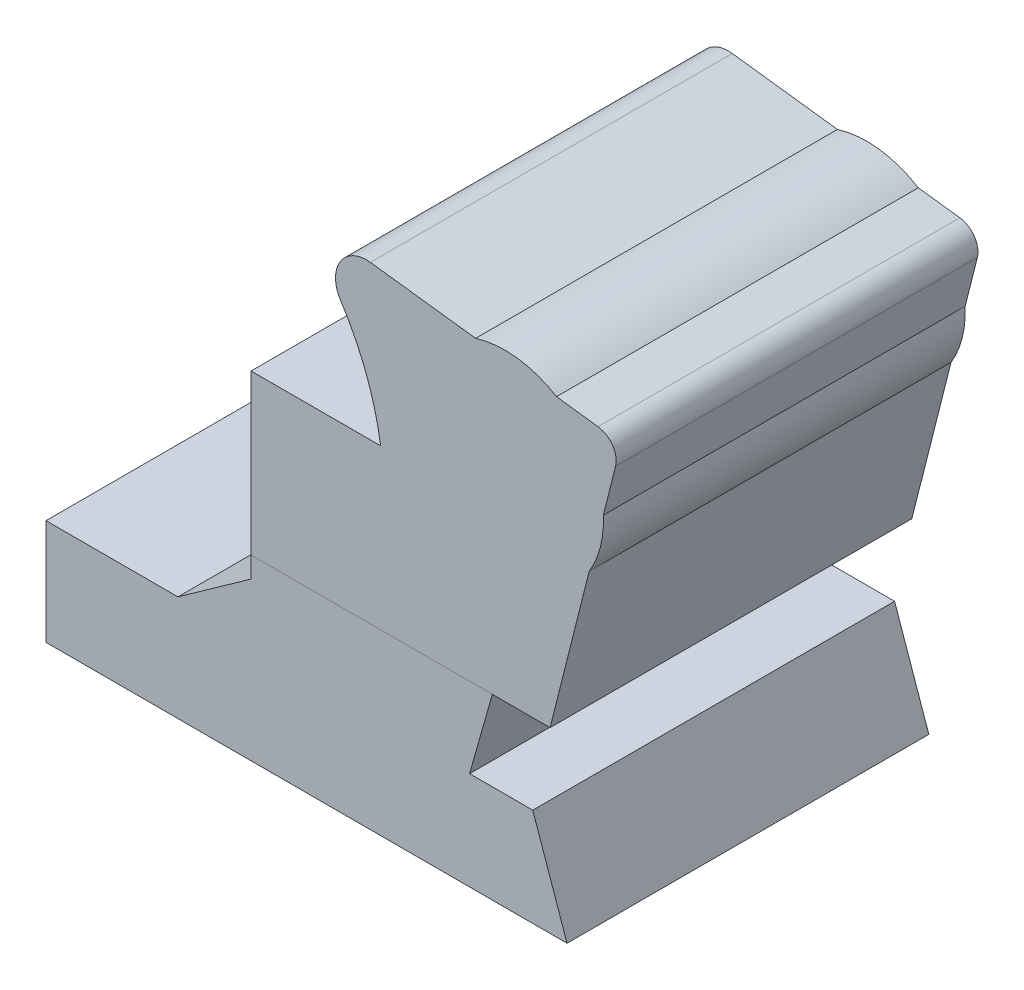
ISO-10303-21;
HEADER;
FILE_DESCRIPTION(('STEP AP214'),'2;1');
FILE_NAME('part.step','',(''),(''),'','','');
FILE_SCHEMA(('AUTOMOTIVE_DESIGN { 1 0 10303 214 1 1 1 1 }'));
ENDSEC;
DATA;
#1=APPLICATION_CONTEXT('core data for automotive mechanical design processes');
#2=APPLICATION_PROTOCOL_DEFINITION('international standard','automotive_design',2000,#1);
#3=PRODUCT_CONTEXT('',#1,'mechanical');
#4=PRODUCT('Part','Part','',(#3));
#5=PRODUCT_RELATED_PRODUCT_CATEGORY('part','',(#4));
#6=PRODUCT_DEFINITION_FORMATION('','',#4);
#7=PRODUCT_DEFINITION_CONTEXT('part definition',#1,'design');
#8=PRODUCT_DEFINITION('design','',#6,#7);
#9=PRODUCT_DEFINITION_SHAPE('','',#8);
#10=(LENGTH_UNIT() NAMED_UNIT(*) SI_UNIT(.MILLI.,.METRE.));
#11=(NAMED_UNIT(*) PLANE_ANGLE_UNIT() SI_UNIT($,.RADIAN.));
#12=(NAMED_UNIT(*) SI_UNIT($,.STERADIAN.) SOLID_ANGLE_UNIT());
#13=UNCERTAINTY_MEASURE_WITH_UNIT(LENGTH_MEASURE(1.E-05),#10,'distance_accuracy_value','');
#14=(GEOMETRIC_REPRESENTATION_CONTEXT(3) GLOBAL_UNCERTAINTY_ASSIGNED_CONTEXT((#13)) GLOBAL_UNIT_ASSIGNED_CONTEXT((#10,
#11,#12)) REPRESENTATION_CONTEXT('',''));
#15=CARTESIAN_POINT('',(0.,0.,0.));
#16=DIRECTION('',(0.,0.,1.));
#17=DIRECTION('',(1.,0.,0.));
#18=AXIS2_PLACEMENT_3D('',#15,#16,#17);
#19=CARTESIAN_POINT('',(123.35351613374,49.2574282315053,-50.01));
#20=DIRECTION('',(0.,1.,0.));
#21=DIRECTION('',(0.,0.,1.));
#22=AXIS2_PLACEMENT_3D('',#19,#20,#21);
#23=PLANE('',#22);
#24=DIRECTION('',(0.,0.,-1.));
#25=VECTOR('',#24,1.);
#26=CARTESIAN_POINT('',(123.35351613374,49.2574282315053,50.));
#27=LINE('',#26,#25);
#28=CARTESIAN_POINT('',(123.35351613374,49.2574282315053,50.));
#29=VERTEX_POINT('',#28);
#30=CARTESIAN_POINT('',(123.35351613374,49.2574282315053,-50.));
#31=VERTEX_POINT('',#30);
#32=EDGE_CURVE('E224',#29,#31,#27,.T.);
#33=ORIENTED_EDGE('',*,*,#32,.T.);
#34=DIRECTION('',(-1.,0.,0.));
#35=VECTOR('',#34,1.);
#36=CARTESIAN_POINT('',(18.9674720334947,49.2574282315053,-50.));
#37=LINE('',#36,#35);
#38=CARTESIAN_POINT('',(56.6720409296533,49.2574282315053,-50.));
#39=VERTEX_POINT('',#38);
#40=EDGE_CURVE('E221',#31,#39,#37,.T.);
#41=ORIENTED_EDGE('',*,*,#40,.T.);
#42=DIRECTION('',(0.,0.,-1.));
#43=VECTOR('',#42,1.);
#44=CARTESIAN_POINT('',(56.6720409296533,49.2574282315053,50.));
#45=LINE('',#44,#43);
#46=CARTESIAN_POINT('',(56.6720409296533,49.2574282315053,50.));
#47=VERTEX_POINT('',#46);
#48=EDGE_CURVE('E215',#47,#39,#45,.T.);
#49=ORIENTED_EDGE('',*,*,#48,.F.);
#50=DIRECTION('',(-1.,0.,0.));
#51=VECTOR('',#50,1.);
#52=CARTESIAN_POINT('',(18.9674720334947,49.2574282315053,50.));
#53=LINE('',#52,#51);
#54=EDGE_CURVE('E218',#29,#47,#53,.T.);
#55=ORIENTED_EDGE('',*,*,#54,.F.);
#56=EDGE_LOOP('',(#33,#41,#49,#55));
#57=FACE_BOUND('',#56,.T.);
#58=ADVANCED_FACE('F103',(#57),#23,.T.);
#59=CARTESIAN_POINT('',(18.9674720334947,82.2196640942758,-50.));
#60=DIRECTION('',(0.,0.,1.));
#61=DIRECTION('',(1.,0.,0.));
#62=AXIS2_PLACEMENT_3D('',#59,#60,#61);
#63=PLANE('',#62);
#64=ORIENTED_EDGE('',*,*,#40,.F.);
#65=DIRECTION('',(0.272992561553901,0.962016144010192,0.));
#66=VECTOR('',#65,1.);
#67=CARTESIAN_POINT('',(117.07216143834,27.1221561609669,-50.));
#68=LINE('',#67,#66);
#69=CARTESIAN_POINT('',(117.07216143834,27.1221561609669,-50.));
#70=VERTEX_POINT('',#69);
#71=EDGE_CURVE('E13',#70,#31,#68,.T.);
#72=ORIENTED_EDGE('',*,*,#71,.F.);
#73=DIRECTION('',(-1.,0.,0.));
#74=VECTOR('',#73,1.);
#75=CARTESIAN_POINT('',(134.529857437009,27.1221561609669,-50.));
#76=LINE('',#75,#74);
#77=CARTESIAN_POINT('',(134.529857437009,27.1221561609669,-50.));
#78=VERTEX_POINT('',#77);
#79=EDGE_CURVE('E113',#78,#70,#76,.T.);
#80=ORIENTED_EDGE('',*,*,#79,.F.);
#81=DIRECTION('',(-0.329680146877429,0.944092686527587,0.));
#82=VECTOR('',#81,1.);
#83=CARTESIAN_POINT('',(144.001,0.,-50.));
#84=LINE('',#83,#82);
#85=CARTESIAN_POINT('',(144.001,0.,-50.));
#86=VERTEX_POINT('',#85);
#87=EDGE_CURVE('E186',#86,#78,#84,.T.);
#88=ORIENTED_EDGE('',*,*,#87,.F.);
#89=DIRECTION('',(1.,0.,0.));
#90=VECTOR('',#89,1.);
#91=CARTESIAN_POINT('',(0.,0.,-50.));
#92=LINE('',#91,#90);
#93=CARTESIAN_POINT('',(0.,0.,-50.));
#94=VERTEX_POINT('',#93);
#95=EDGE_CURVE('E176',#94,#86,#92,.T.);
#96=ORIENTED_EDGE('',*,*,#95,.F.);
#97=DIRECTION('',(0.,1.,0.));
#98=VECTOR('',#97,1.);
#99=CARTESIAN_POINT('',(0.,0.,-50.));
#100=LINE('',#99,#98);
#101=CARTESIAN_POINT('',(0.,29.1478914141799,-50.));
#102=VERTEX_POINT('',#101);
#103=EDGE_CURVE('E187',#94,#102,#100,.T.);
#104=ORIENTED_EDGE('',*,*,#103,.T.);
#105=DIRECTION('',(1.,0.,0.));
#106=VECTOR('',#105,1.);
#107=CARTESIAN_POINT('',(0.,29.1478914141799,-50.));
#108=LINE('',#107,#106);
#109=CARTESIAN_POINT('',(36.4760061966196,29.1478914141799,-50.));
#110=VERTEX_POINT('',#109);
#111=EDGE_CURVE('E244',#102,#110,#108,.T.);
#112=ORIENTED_EDGE('',*,*,#111,.T.);
#113=DIRECTION('',(0.815058374775216,0.579378844719743,0.));
#114=VECTOR('',#113,1.);
#115=CARTESIAN_POINT('',(36.4760061966196,29.1478914141799,-50.));
#116=LINE('',#115,#114);
#117=CARTESIAN_POINT('',(56.6720409296533,43.5041088750114,-50.));
#118=VERTEX_POINT('',#117);
#119=EDGE_CURVE('E242',#110,#118,#116,.T.);
#120=ORIENTED_EDGE('',*,*,#119,.T.);
#121=DIRECTION('',(0.,1.,0.));
#122=VECTOR('',#121,1.);
#123=CARTESIAN_POINT('',(56.6720409296533,43.5041088750114,-50.));
#124=LINE('',#123,#122);
#125=EDGE_CURVE('E107',#118,#39,#124,.T.);
#126=ORIENTED_EDGE('',*,*,#125,.T.);
#127=EDGE_LOOP('',(#64,#72,#80,#88,#96,#104,#112,#120,#126));
#128=FACE_BOUND('',#127,.T.);
#129=ADVANCED_FACE('F194',(#128),#63,.F.);
#130=CARTESIAN_POINT('',(18.9674720334947,82.2196640942758,50.));
#131=DIRECTION('',(0.,0.,1.));
#132=DIRECTION('',(1.,0.,0.));
#133=AXIS2_PLACEMENT_3D('',#130,#131,#132);
#134=PLANE('',#133);
#135=DIRECTION('',(0.272992561553901,0.962016144010192,0.));
#136=VECTOR('',#135,1.);
#137=CARTESIAN_POINT('',(117.07216143834,27.1221561609669,50.));
#138=LINE('',#137,#136);
#139=CARTESIAN_POINT('',(117.07216143834,27.1221561609669,50.));
#140=VERTEX_POINT('',#139);
#141=EDGE_CURVE('E213',#140,#29,#138,.T.);
#142=ORIENTED_EDGE('',*,*,#141,.T.);
#143=ORIENTED_EDGE('',*,*,#54,.T.);
#144=DIRECTION('',(0.,1.,0.));
#145=VECTOR('',#144,1.);
#146=CARTESIAN_POINT('',(56.6720409296533,43.5041088750114,50.));
#147=LINE('',#146,#145);
#148=CARTESIAN_POINT('',(56.6720409296533,43.5041088750114,50.));
#149=VERTEX_POINT('',#148);
#150=EDGE_CURVE('E203',#149,#47,#147,.T.);
#151=ORIENTED_EDGE('',*,*,#150,.F.);
#152=DIRECTION('',(0.815058374775216,0.579378844719743,0.));
#153=VECTOR('',#152,1.);
#154=CARTESIAN_POINT('',(36.4760061966196,29.1478914141799,50.));
#155=LINE('',#154,#153);
#156=CARTESIAN_POINT('',(36.4760061966196,29.1478914141799,50.));
#157=VERTEX_POINT('',#156);
#158=EDGE_CURVE('E200',#157,#149,#155,.T.);
#159=ORIENTED_EDGE('',*,*,#158,.F.);
#160=DIRECTION('',(1.,0.,0.));
#161=VECTOR('',#160,1.);
#162=CARTESIAN_POINT('',(0.,29.1478914141799,50.));
#163=LINE('',#162,#161);
#164=CARTESIAN_POINT('',(0.,29.1478914141799,50.));
#165=VERTEX_POINT('',#164);
#166=EDGE_CURVE('E202',#165,#157,#163,.T.);
#167=ORIENTED_EDGE('',*,*,#166,.F.);
#168=DIRECTION('',(0.,1.,0.));
#169=VECTOR('',#168,1.);
#170=CARTESIAN_POINT('',(0.,0.,50.));
#171=LINE('',#170,#169);
#172=CARTESIAN_POINT('',(0.,0.,50.));
#173=VERTEX_POINT('',#172);
#174=EDGE_CURVE('E206',#173,#165,#171,.T.);
#175=ORIENTED_EDGE('',*,*,#174,.F.);
#176=DIRECTION('',(1.,0.,0.));
#177=VECTOR('',#176,1.);
#178=CARTESIAN_POINT('',(0.,0.,50.));
#179=LINE('',#178,#177);
#180=CARTESIAN_POINT('',(144.001,0.,50.));
#181=VERTEX_POINT('',#180);
#182=EDGE_CURVE('E209',#173,#181,#179,.T.);
#183=ORIENTED_EDGE('',*,*,#182,.T.);
#184=DIRECTION('',(-0.329680146877429,0.944092686527587,0.));
#185=VECTOR('',#184,1.);
#186=CARTESIAN_POINT('',(144.001,0.,50.));
#187=LINE('',#186,#185);
#188=CARTESIAN_POINT('',(134.529857437009,27.1221561609669,50.));
#189=VERTEX_POINT('',#188);
#190=EDGE_CURVE('E148',#181,#189,#187,.T.);
#191=ORIENTED_EDGE('',*,*,#190,.T.);
#192=DIRECTION('',(-1.,0.,0.));
#193=VECTOR('',#192,1.);
#194=CARTESIAN_POINT('',(134.529857437009,27.1221561609669,50.));
#195=LINE('',#194,#193);
#196=EDGE_CURVE('E153',#189,#140,#195,.T.);
#197=ORIENTED_EDGE('',*,*,#196,.T.);
#198=EDGE_LOOP('',(#142,#143,#151,#159,#167,#175,#183,#191,#197));
#199=FACE_BOUND('',#198,.T.);
#200=ADVANCED_FACE('F265',(#199),#134,.T.);
#201=CARTESIAN_POINT('',(56.6720409296533,43.5041088750114,50.));
#202=DIRECTION('',(-1.,0.,0.));
#203=DIRECTION('',(0.,-1.,0.));
#204=AXIS2_PLACEMENT_3D('',#201,#202,#203);
#205=PLANE('',#204);
#206=ORIENTED_EDGE('',*,*,#150,.T.);
#207=ORIENTED_EDGE('',*,*,#48,.T.);
#208=ORIENTED_EDGE('',*,*,#125,.F.);
#209=DIRECTION('',(0.,0.,-1.));
#210=VECTOR('',#209,1.);
#211=CARTESIAN_POINT('',(56.6720409296533,43.5041088750114,50.));
#212=LINE('',#211,#210);
#213=EDGE_CURVE('E160',#149,#118,#212,.T.);
#214=ORIENTED_EDGE('',*,*,#213,.F.);
#215=EDGE_LOOP('',(#206,#207,#208,#214));
#216=FACE_BOUND('',#215,.T.);
#217=ADVANCED_FACE('F105',(#216),#205,.T.);
#218=CARTESIAN_POINT('',(36.4760061966196,29.1478914141799,50.));
#219=DIRECTION('',(-0.579378844719743,0.815058374775216,0.));
#220=DIRECTION('',(-0.815058374775216,-0.579378844719743,0.));
#221=AXIS2_PLACEMENT_3D('',#218,#219,#220);
#222=PLANE('',#221);
#223=ORIENTED_EDGE('',*,*,#119,.F.);
#224=DIRECTION('',(0.,0.,-1.));
#225=VECTOR('',#224,1.);
#226=CARTESIAN_POINT('',(36.4760061966196,29.1478914141799,50.));
#227=LINE('',#226,#225);
#228=EDGE_CURVE('E239',#157,#110,#227,.T.);
#229=ORIENTED_EDGE('',*,*,#228,.F.);
#230=ORIENTED_EDGE('',*,*,#158,.T.);
#231=ORIENTED_EDGE('',*,*,#213,.T.);
#232=EDGE_LOOP('',(#223,#229,#230,#231));
#233=FACE_BOUND('',#232,.T.);
#234=ADVANCED_FACE('F254',(#233),#222,.T.);
#235=CARTESIAN_POINT('',(0.,29.1478914141799,50.));
#236=DIRECTION('',(0.,1.,0.));
#237=DIRECTION('',(0.,0.,1.));
#238=AXIS2_PLACEMENT_3D('',#235,#236,#237);
#239=PLANE('',#238);
#240=ORIENTED_EDGE('',*,*,#111,.F.);
#241=DIRECTION('',(0.,0.,-1.));
#242=VECTOR('',#241,1.);
#243=CARTESIAN_POINT('',(0.,29.1478914141799,50.));
#244=LINE('',#243,#242);
#245=EDGE_CURVE('E237',#165,#102,#244,.T.);
#246=ORIENTED_EDGE('',*,*,#245,.F.);
#247=ORIENTED_EDGE('',*,*,#166,.T.);
#248=ORIENTED_EDGE('',*,*,#228,.T.);
#249=EDGE_LOOP('',(#240,#246,#247,#248));
#250=FACE_BOUND('',#249,.T.);
#251=ADVANCED_FACE('F252',(#250),#239,.T.);
#252=CARTESIAN_POINT('',(0.,0.,50.));
#253=DIRECTION('',(-1.,0.,0.));
#254=DIRECTION('',(0.,0.,1.));
#255=AXIS2_PLACEMENT_3D('',#252,#253,#254);
#256=PLANE('',#255);
#257=ORIENTED_EDGE('',*,*,#103,.F.);
#258=DIRECTION('',(0.,0.,-1.));
#259=VECTOR('',#258,1.);
#260=CARTESIAN_POINT('',(0.,0.,50.));
#261=LINE('',#260,#259);
#262=EDGE_CURVE('E181',#173,#94,#261,.T.);
#263=ORIENTED_EDGE('',*,*,#262,.F.);
#264=ORIENTED_EDGE('',*,*,#174,.T.);
#265=ORIENTED_EDGE('',*,*,#245,.T.);
#266=EDGE_LOOP('',(#257,#263,#264,#265));
#267=FACE_BOUND('',#266,.T.);
#268=ADVANCED_FACE('F248',(#267),#256,.T.);
#269=CARTESIAN_POINT('',(0.,0.,50.));
#270=DIRECTION('',(0.,1.,0.));
#271=DIRECTION('',(0.,0.,1.));
#272=AXIS2_PLACEMENT_3D('',#269,#270,#271);
#273=PLANE('',#272);
#274=ORIENTED_EDGE('',*,*,#95,.T.);
#275=DIRECTION('',(0.,0.,-1.));
#276=VECTOR('',#275,1.);
#277=CARTESIAN_POINT('',(144.001,0.,50.));
#278=LINE('',#277,#276);
#279=EDGE_CURVE('E180',#181,#86,#278,.T.);
#280=ORIENTED_EDGE('',*,*,#279,.F.);
#281=ORIENTED_EDGE('',*,*,#182,.F.);
#282=ORIENTED_EDGE('',*,*,#262,.T.);
#283=EDGE_LOOP('',(#274,#280,#281,#282));
#284=FACE_BOUND('',#283,.T.);
#285=ADVANCED_FACE('F178',(#284),#273,.F.);
#286=CARTESIAN_POINT('',(144.001,0.,50.));
#287=DIRECTION('',(-0.944092686527587,-0.329680146877429,0.));
#288=DIRECTION('',(0.329680146877429,-0.944092686527587,0.));
#289=AXIS2_PLACEMENT_3D('',#286,#287,#288);
#290=PLANE('',#289);
#291=ORIENTED_EDGE('',*,*,#87,.T.);
#292=DIRECTION('',(0.,0.,-1.));
#293=VECTOR('',#292,1.);
#294=CARTESIAN_POINT('',(134.529857437009,27.1221561609669,50.));
#295=LINE('',#294,#293);
#296=EDGE_CURVE('E191',#189,#78,#295,.T.);
#297=ORIENTED_EDGE('',*,*,#296,.F.);
#298=ORIENTED_EDGE('',*,*,#190,.F.);
#299=ORIENTED_EDGE('',*,*,#279,.T.);
#300=EDGE_LOOP('',(#291,#297,#298,#299));
#301=FACE_BOUND('',#300,.T.);
#302=ADVANCED_FACE('F190',(#301),#290,.F.);
#303=CARTESIAN_POINT('',(134.529857437009,27.1221561609669,50.));
#304=DIRECTION('',(0.,-1.,0.));
#305=DIRECTION('',(0.,0.,-1.));
#306=AXIS2_PLACEMENT_3D('',#303,#304,#305);
#307=PLANE('',#306);
#308=ORIENTED_EDGE('',*,*,#79,.T.);
#309=DIRECTION('',(0.,0.,-1.));
#310=VECTOR('',#309,1.);
#311=CARTESIAN_POINT('',(117.07216143834,27.1221561609669,50.));
#312=LINE('',#311,#310);
#313=EDGE_CURVE('E227',#140,#70,#312,.T.);
#314=ORIENTED_EDGE('',*,*,#313,.F.);
#315=ORIENTED_EDGE('',*,*,#196,.F.);
#316=ORIENTED_EDGE('',*,*,#296,.T.);
#317=EDGE_LOOP('',(#308,#314,#315,#316));
#318=FACE_BOUND('',#317,.T.);
#319=ADVANCED_FACE('F268',(#318),#307,.F.);
#320=CARTESIAN_POINT('',(117.07216143834,27.1221561609669,50.));
#321=DIRECTION('',(-0.962016144010193,0.272992561553901,0.));
#322=DIRECTION('',(-0.272992561553901,-0.962016144010193,0.));
#323=AXIS2_PLACEMENT_3D('',#320,#321,#322);
#324=PLANE('',#323);
#325=ORIENTED_EDGE('',*,*,#71,.T.);
#326=ORIENTED_EDGE('',*,*,#32,.F.);
#327=ORIENTED_EDGE('',*,*,#141,.F.);
#328=ORIENTED_EDGE('',*,*,#313,.T.);
#329=EDGE_LOOP('',(#325,#326,#327,#328));
#330=FACE_BOUND('',#329,.T.);
#331=ADVANCED_FACE('F266',(#330),#324,.F.);
#332=CLOSED_SHELL('',(#58,#129,#200,#217,#234,#251,#268,#285,#302,#319,#331));
#333=MANIFOLD_SOLID_BREP('B2',#332);
#334=CARTESIAN_POINT('',(18.9674720334947,82.2196640942758,50.));
#335=DIRECTION('',(0.,0.,-1.));
#336=DIRECTION('',(-1.,0.,0.));
#337=AXIS2_PLACEMENT_3D('',#334,#335,#336);
#338=CYLINDRICAL_SURFACE('',#337,74.3600000000827);
#339=CARTESIAN_POINT('',(18.9674720334947,82.2196640942758,-50.));
#340=DIRECTION('',(0.,0.,1.));
#341=DIRECTION('',(1.,0.,0.));
#342=AXIS2_PLACEMENT_3D('',#339,#340,#341);
#343=CIRCLE('',#342,74.3600000000827);
#344=CARTESIAN_POINT('',(92.4961728839557,93.3074840448214,-50.));
#345=VERTEX_POINT('',#344);
#346=CARTESIAN_POINT('',(81.3935081429262,122.622629525989,-50.));
#347=VERTEX_POINT('',#346);
#348=EDGE_CURVE('E447',#345,#347,#343,.T.);
#349=ORIENTED_EDGE('',*,*,#348,.F.);
#350=DIRECTION('',(0.,0.,-1.));
#351=VECTOR('',#350,1.);
#352=CARTESIAN_POINT('',(92.4961728839557,93.3074840448214,50.));
#353=LINE('',#352,#351);
#354=CARTESIAN_POINT('',(92.4961728839557,93.3074840448214,50.));
#355=VERTEX_POINT('',#354);
#356=EDGE_CURVE('E443',#355,#345,#353,.T.);
#357=ORIENTED_EDGE('',*,*,#356,.F.);
#358=CARTESIAN_POINT('',(18.9674720334947,82.2196640942758,50.));
#359=DIRECTION('',(0.,0.,1.));
#360=DIRECTION('',(1.,0.,0.));
#361=AXIS2_PLACEMENT_3D('',#358,#359,#360);
#362=CIRCLE('',#361,74.3600000000827);
#363=CARTESIAN_POINT('',(81.3935081429262,122.622629525989,50.));
#364=VERTEX_POINT('',#363);
#365=EDGE_CURVE('E445',#355,#364,#362,.T.);
#366=ORIENTED_EDGE('',*,*,#365,.T.);
#367=DIRECTION('',(0.,0.,-1.));
#368=VECTOR('',#367,1.);
#369=CARTESIAN_POINT('',(81.3935081429262,122.622629525989,50.));
#370=LINE('',#369,#368);
#371=EDGE_CURVE('E452',#364,#347,#370,.T.);
#372=ORIENTED_EDGE('',*,*,#371,.T.);
#373=EDGE_LOOP('',(#349,#357,#366,#372));
#374=FACE_BOUND('',#373,.T.);
#375=ADVANCED_FACE('F355',(#374),#338,.F.);
#376=CARTESIAN_POINT('',(88.5965123093914,127.284510152721,50.));
#377=DIRECTION('',(0.,0.,-1.));
#378=DIRECTION('',(-1.,0.,0.));
#379=AXIS2_PLACEMENT_3D('',#376,#377,#378);
#380=CYLINDRICAL_SURFACE('',#379,8.58000000000036);
#381=CARTESIAN_POINT('',(88.5965123093914,127.284510152721,-50.));
#382=DIRECTION('',(0.,0.,-1.));
#383=DIRECTION('',(-1.,0.,0.));
#384=AXIS2_PLACEMENT_3D('',#381,#382,#383);
#385=CIRCLE('',#384,8.58000000000036);
#386=CARTESIAN_POINT('',(89.6610000000004,135.798220622107,-50.));
#387=VERTEX_POINT('',#386);
#388=EDGE_CURVE('E489',#347,#387,#385,.T.);
#389=ORIENTED_EDGE('',*,*,#388,.F.);
#390=ORIENTED_EDGE('',*,*,#371,.F.);
#391=CARTESIAN_POINT('',(88.5965123093914,127.284510152721,50.));
#392=DIRECTION('',(0.,0.,-1.));
#393=DIRECTION('',(-1.,0.,0.));
#394=AXIS2_PLACEMENT_3D('',#391,#392,#393);
#395=CIRCLE('',#394,8.58000000000036);
#396=CARTESIAN_POINT('',(89.6610000000004,135.798220622107,50.));
#397=VERTEX_POINT('',#396);
#398=EDGE_CURVE('E462',#364,#397,#395,.T.);
#399=ORIENTED_EDGE('',*,*,#398,.T.);
#400=DIRECTION('',(0.,0.,-1.));
#401=VECTOR('',#400,1.);
#402=CARTESIAN_POINT('',(89.6610000000004,135.798220622107,50.));
#403=LINE('',#402,#401);
#404=EDGE_CURVE('E514',#397,#387,#403,.T.);
#405=ORIENTED_EDGE('',*,*,#404,.T.);
#406=EDGE_LOOP('',(#389,#390,#399,#405));
#407=FACE_BOUND('',#406,.T.);
#408=ADVANCED_FACE('F560',(#407),#380,.T.);
#409=CARTESIAN_POINT('',(152.575658460408,127.931864380515,50.));
#410=DIRECTION('',(-0.124066164406642,-0.992273947480948,0.));
#411=DIRECTION('',(0.992273947480949,-0.124066164406642,0.));
#412=AXIS2_PLACEMENT_3D('',#409,#410,#411);
#413=PLANE('',#412);
#414=DIRECTION('',(0.,0.,-1.));
#415=VECTOR('',#414,1.);
#416=CARTESIAN_POINT('',(118.740404112364,132.162359637739,50.));
#417=LINE('',#416,#415);
#418=CARTESIAN_POINT('',(118.740404112364,132.162359637739,-50.));
#419=VERTEX_POINT('',#418);
#420=CARTESIAN_POINT('',(118.740404112364,132.162359637739,50.));
#421=VERTEX_POINT('',#420);
#422=EDGE_CURVE('E526',#419,#421,#417,.F.);
#423=ORIENTED_EDGE('',*,*,#422,.F.);
#424=DIRECTION('',(-0.992273947480948,0.124066164406642,0.));
#425=VECTOR('',#424,1.);
#426=CARTESIAN_POINT('',(152.575658460408,127.931864380515,-50.));
#427=LINE('',#426,#425);
#428=EDGE_CURVE('E492',#419,#387,#427,.T.);
#429=ORIENTED_EDGE('',*,*,#428,.T.);
#430=ORIENTED_EDGE('',*,*,#404,.F.);
#431=DIRECTION('',(-0.992273947480948,0.124066164406642,0.));
#432=VECTOR('',#431,1.);
#433=CARTESIAN_POINT('',(152.575658460408,127.931864380515,50.));
#434=LINE('',#433,#432);
#435=EDGE_CURVE('E473',#421,#397,#434,.T.);
#436=ORIENTED_EDGE('',*,*,#435,.F.);
#437=EDGE_LOOP('',(#423,#429,#430,#436));
#438=FACE_BOUND('',#437,.T.);
#439=ADVANCED_FACE('F556',(#438),#413,.F.);
#440=CARTESIAN_POINT('',(126.841000000001,106.1775,50.));
#441=DIRECTION('',(0.,0.,-1.));
#442=DIRECTION('',(-1.,0.,0.));
#443=AXIS2_PLACEMENT_3D('',#440,#441,#442);
#444=CYLINDRICAL_SURFACE('',#443,27.2182399160523);
#445=CARTESIAN_POINT('',(126.841000000001,106.1775,-50.));
#446=DIRECTION('',(0.,0.,1.));
#447=DIRECTION('',(1.,0.,0.));
#448=AXIS2_PLACEMENT_3D('',#445,#446,#447);
#449=CIRCLE('',#448,27.2182399160523);
#450=CARTESIAN_POINT('',(141.09008904293,129.367930042896,-50.));
#451=VERTEX_POINT('',#450);
#452=EDGE_CURVE('E521',#451,#419,#449,.T.);
#453=ORIENTED_EDGE('',*,*,#452,.T.);
#454=ORIENTED_EDGE('',*,*,#422,.T.);
#455=CARTESIAN_POINT('',(126.841000000001,106.1775,50.));
#456=DIRECTION('',(0.,0.,1.));
#457=DIRECTION('',(1.,0.,0.));
#458=AXIS2_PLACEMENT_3D('',#455,#456,#457);
#459=CIRCLE('',#458,27.2182399160523);
#460=CARTESIAN_POINT('',(141.09008904293,129.367930042896,50.));
#461=VERTEX_POINT('',#460);
#462=EDGE_CURVE('E487',#461,#421,#459,.T.);
#463=ORIENTED_EDGE('',*,*,#462,.F.);
#464=DIRECTION('',(0.,0.,-1.));
#465=VECTOR('',#464,1.);
#466=CARTESIAN_POINT('',(141.09008904293,129.367930042896,50.));
#467=LINE('',#466,#465);
#468=EDGE_CURVE('E504',#461,#451,#467,.T.);
#469=ORIENTED_EDGE('',*,*,#468,.T.);
#470=EDGE_LOOP('',(#453,#454,#463,#469));
#471=FACE_BOUND('',#470,.T.);
#472=ADVANCED_FACE('F553',(#471),#444,.T.);
#473=ORIENTED_EDGE('',*,*,#468,.F.);
#474=CARTESIAN_POINT('',(152.575658460408,127.931864380515,50.));
#475=VERTEX_POINT('',#474);
#476=EDGE_CURVE('E474',#475,#461,#434,.T.);
#477=ORIENTED_EDGE('',*,*,#476,.F.);
#478=DIRECTION('',(0.,0.,-1.));
#479=VECTOR('',#478,1.);
#480=CARTESIAN_POINT('',(152.575658460408,127.931864380515,50.));
#481=LINE('',#480,#479);
#482=CARTESIAN_POINT('',(152.575658460408,127.931864380515,-50.));
#483=VERTEX_POINT('',#482);
#484=EDGE_CURVE('E511',#475,#483,#481,.T.);
#485=ORIENTED_EDGE('',*,*,#484,.T.);
#486=EDGE_CURVE('E493',#483,#451,#427,.T.);
#487=ORIENTED_EDGE('',*,*,#486,.T.);
#488=EDGE_LOOP('',(#473,#477,#485,#487));
#489=FACE_BOUND('',#488,.T.);
#490=ADVANCED_FACE('F548',(#489),#413,.F.);
#491=CARTESIAN_POINT('',(151.866000000002,122.256057400924,50.));
#492=DIRECTION('',(0.,0.,-1.));
#493=DIRECTION('',(-1.,0.,0.));
#494=AXIS2_PLACEMENT_3D('',#491,#492,#493);
#495=CYLINDRICAL_SURFACE('',#494,5.71999999999996);
#496=CARTESIAN_POINT('',(151.866000000002,122.256057400924,-50.));
#497=DIRECTION('',(0.,0.,1.));
#498=DIRECTION('',(1.,0.,0.));
#499=AXIS2_PLACEMENT_3D('',#496,#497,#498);
#500=CIRCLE('',#499,5.71999999999996);
#501=CARTESIAN_POINT('',(157.411382405651,120.85351186686,-50.));
#502=VERTEX_POINT('',#501);
#503=EDGE_CURVE('E496',#502,#483,#500,.T.);
#504=ORIENTED_EDGE('',*,*,#503,.T.);
#505=ORIENTED_EDGE('',*,*,#484,.F.);
#506=CARTESIAN_POINT('',(151.866000000002,122.256057400924,50.));
#507=DIRECTION('',(0.,0.,1.));
#508=DIRECTION('',(1.,0.,0.));
#509=AXIS2_PLACEMENT_3D('',#506,#507,#508);
#510=CIRCLE('',#509,5.71999999999996);
#511=CARTESIAN_POINT('',(157.411382405651,120.85351186686,50.));
#512=VERTEX_POINT('',#511);
#513=EDGE_CURVE('E477',#512,#475,#510,.T.);
#514=ORIENTED_EDGE('',*,*,#513,.F.);
#515=DIRECTION('',(0.,0.,-1.));
#516=VECTOR('',#515,1.);
#517=CARTESIAN_POINT('',(157.411382405651,120.85351186686,50.));
#518=LINE('',#517,#516);
#519=EDGE_CURVE('E508',#512,#502,#518,.T.);
#520=ORIENTED_EDGE('',*,*,#519,.T.);
#521=EDGE_LOOP('',(#504,#505,#514,#520));
#522=FACE_BOUND('',#521,.T.);
#523=ADVANCED_FACE('F542',(#522),#495,.T.);
#524=CARTESIAN_POINT('',(139.303205184739,49.2574282315053,50.));
#525=DIRECTION('',(-0.969472448539981,0.24520026819295,0.));
#526=DIRECTION('',(-0.24520026819295,-0.969472448539981,0.));
#527=AXIS2_PLACEMENT_3D('',#524,#525,#526);
#528=PLANE('',#527);
#529=DIRECTION('',(0.,0.,-1.));
#530=VECTOR('',#529,1.);
#531=CARTESIAN_POINT('',(154.028196984966,107.477078481087,50.));
#532=LINE('',#531,#530);
#533=CARTESIAN_POINT('',(154.028196984966,107.477078481087,-50.));
#534=VERTEX_POINT('',#533);
#535=CARTESIAN_POINT('',(154.028196984966,107.477078481087,50.));
#536=VERTEX_POINT('',#535);
#537=EDGE_CURVE('E363',#534,#536,#532,.F.);
#538=ORIENTED_EDGE('',*,*,#537,.F.);
#539=DIRECTION('',(0.24520026819295,0.96947244853998,0.));
#540=VECTOR('',#539,1.);
#541=CARTESIAN_POINT('',(139.303205184739,49.2574282315053,-50.));
#542=LINE('',#541,#540);
#543=EDGE_CURVE('E498',#534,#502,#542,.T.);
#544=ORIENTED_EDGE('',*,*,#543,.T.);
#545=ORIENTED_EDGE('',*,*,#519,.F.);
#546=DIRECTION('',(0.24520026819295,0.96947244853998,0.));
#547=VECTOR('',#546,1.);
#548=CARTESIAN_POINT('',(139.303205184739,49.2574282315053,50.));
#549=LINE('',#548,#547);
#550=EDGE_CURVE('E479',#536,#512,#549,.T.);
#551=ORIENTED_EDGE('',*,*,#550,.F.);
#552=EDGE_LOOP('',(#538,#544,#545,#551));
#553=FACE_BOUND('',#552,.T.);
#554=ADVANCED_FACE('F537',(#553),#528,.F.);
#555=CARTESIAN_POINT('',(150.141177621161,92.1085872150625,-50.));
#556=VERTEX_POINT('',#555);
#557=EDGE_CURVE('E522',#556,#534,#449,.T.);
#558=ORIENTED_EDGE('',*,*,#557,.T.);
#559=ORIENTED_EDGE('',*,*,#537,.T.);
#560=CARTESIAN_POINT('',(150.141177621161,92.1085872150625,50.));
#561=VERTEX_POINT('',#560);
#562=EDGE_CURVE('E518',#561,#536,#459,.T.);
#563=ORIENTED_EDGE('',*,*,#562,.F.);
#564=DIRECTION('',(0.,0.,-1.));
#565=VECTOR('',#564,1.);
#566=CARTESIAN_POINT('',(150.141177621161,92.1085872150625,50.));
#567=LINE('',#566,#565);
#568=EDGE_CURVE('E528',#561,#556,#567,.T.);
#569=ORIENTED_EDGE('',*,*,#568,.T.);
#570=EDGE_LOOP('',(#558,#559,#563,#569));
#571=FACE_BOUND('',#570,.T.);
#572=ADVANCED_FACE('F357',(#571),#444,.T.);
#573=CARTESIAN_POINT('',(56.6720409296533,93.3074840448214,50.));
#574=DIRECTION('',(0.,1.,0.));
#575=DIRECTION('',(0.,0.,1.));
#576=AXIS2_PLACEMENT_3D('',#573,#574,#575);
#577=PLANE('',#576);
#578=DIRECTION('',(1.,0.,0.));
#579=VECTOR('',#578,1.);
#580=CARTESIAN_POINT('',(56.6720409296533,93.3074840448214,-50.));
#581=LINE('',#580,#579);
#582=CARTESIAN_POINT('',(56.6720409296533,93.3074840448214,-50.));
#583=VERTEX_POINT('',#582);
#584=EDGE_CURVE('E485',#583,#345,#581,.T.);
#585=ORIENTED_EDGE('',*,*,#584,.F.);
#586=DIRECTION('',(0.,0.,-1.));
#587=VECTOR('',#586,1.);
#588=CARTESIAN_POINT('',(56.6720409296533,93.3074840448214,50.));
#589=LINE('',#588,#587);
#590=CARTESIAN_POINT('',(56.6720409296533,93.3074840448214,50.));
#591=VERTEX_POINT('',#590);
#592=EDGE_CURVE('E467',#591,#583,#589,.T.);
#593=ORIENTED_EDGE('',*,*,#592,.F.);
#594=DIRECTION('',(1.,0.,0.));
#595=VECTOR('',#594,1.);
#596=CARTESIAN_POINT('',(56.6720409296533,93.3074840448214,50.));
#597=LINE('',#596,#595);
#598=EDGE_CURVE('E460',#591,#355,#597,.T.);
#599=ORIENTED_EDGE('',*,*,#598,.T.);
#600=ORIENTED_EDGE('',*,*,#356,.T.);
#601=EDGE_LOOP('',(#585,#593,#599,#600));
#602=FACE_BOUND('',#601,.T.);
#603=ADVANCED_FACE('F465',(#602),#577,.T.);
#604=CARTESIAN_POINT('',(18.9674720334947,82.2196640942758,50.));
#605=DIRECTION('',(0.,0.,1.));
#606=DIRECTION('',(1.,0.,0.));
#607=AXIS2_PLACEMENT_3D('',#604,#605,#606);
#608=PLANE('',#607);
#609=DIRECTION('',(0.,1.,0.));
#610=VECTOR('',#609,1.);
#611=CARTESIAN_POINT('',(56.6720409296533,43.5041088750114,50.));
#612=LINE('',#611,#610);
#613=CARTESIAN_POINT('',(56.6720409296533,49.2574282315053,50.));
#614=VERTEX_POINT('',#613);
#615=EDGE_CURVE('E453',#614,#591,#612,.T.);
#616=ORIENTED_EDGE('',*,*,#615,.F.);
#617=DIRECTION('',(1.,0.,0.));
#618=VECTOR('',#617,1.);
#619=CARTESIAN_POINT('',(123.35351613374,49.2574282315053,50.));
#620=LINE('',#619,#618);
#621=CARTESIAN_POINT('',(139.303205184739,49.2574282315053,50.));
#622=VERTEX_POINT('',#621);
#623=EDGE_CURVE('E376',#614,#622,#620,.T.);
#624=ORIENTED_EDGE('',*,*,#623,.T.);
#625=EDGE_CURVE('E480',#622,#561,#549,.T.);
#626=ORIENTED_EDGE('',*,*,#625,.T.);
#627=ORIENTED_EDGE('',*,*,#562,.T.);
#628=ORIENTED_EDGE('',*,*,#550,.T.);
#629=ORIENTED_EDGE('',*,*,#513,.T.);
#630=ORIENTED_EDGE('',*,*,#476,.T.);
#631=ORIENTED_EDGE('',*,*,#462,.T.);
#632=ORIENTED_EDGE('',*,*,#435,.T.);
#633=ORIENTED_EDGE('',*,*,#398,.F.);
#634=ORIENTED_EDGE('',*,*,#365,.F.);
#635=ORIENTED_EDGE('',*,*,#598,.F.);
#636=EDGE_LOOP('',(#616,#624,#626,#627,#628,#629,#630,#631,#632,#633,#634,#635));
#637=FACE_BOUND('',#636,.T.);
#638=ADVANCED_FACE('F459',(#637),#608,.T.);
#639=ORIENTED_EDGE('',*,*,#568,.F.);
#640=ORIENTED_EDGE('',*,*,#625,.F.);
#641=DIRECTION('',(0.,0.,-1.));
#642=VECTOR('',#641,1.);
#643=CARTESIAN_POINT('',(139.303205184739,49.2574282315053,50.));
#644=LINE('',#643,#642);
#645=CARTESIAN_POINT('',(139.303205184739,49.2574282315053,-50.));
#646=VERTEX_POINT('',#645);
#647=EDGE_CURVE('E505',#622,#646,#644,.T.);
#648=ORIENTED_EDGE('',*,*,#647,.T.);
#649=EDGE_CURVE('E499',#646,#556,#542,.T.);
#650=ORIENTED_EDGE('',*,*,#649,.T.);
#651=EDGE_LOOP('',(#639,#640,#648,#650));
#652=FACE_BOUND('',#651,.T.);
#653=ADVANCED_FACE('F567',(#652),#528,.F.);
#654=CARTESIAN_POINT('',(18.9674720334947,82.2196640942758,-50.));
#655=DIRECTION('',(0.,0.,1.));
#656=DIRECTION('',(1.,0.,0.));
#657=AXIS2_PLACEMENT_3D('',#654,#655,#656);
#658=PLANE('',#657);
#659=DIRECTION('',(1.,0.,0.));
#660=VECTOR('',#659,1.);
#661=CARTESIAN_POINT('',(123.35351613374,49.2574282315053,-50.));
#662=LINE('',#661,#660);
#663=CARTESIAN_POINT('',(56.6720409296533,49.2574282315053,-50.));
#664=VERTEX_POINT('',#663);
#665=EDGE_CURVE('E370',#664,#646,#662,.T.);
#666=ORIENTED_EDGE('',*,*,#665,.F.);
#667=DIRECTION('',(0.,1.,0.));
#668=VECTOR('',#667,1.);
#669=CARTESIAN_POINT('',(56.6720409296533,43.5041088750114,-50.));
#670=LINE('',#669,#668);
#671=EDGE_CURVE('E468',#664,#583,#670,.T.);
#672=ORIENTED_EDGE('',*,*,#671,.T.);
#673=ORIENTED_EDGE('',*,*,#584,.T.);
#674=ORIENTED_EDGE('',*,*,#348,.T.);
#675=ORIENTED_EDGE('',*,*,#388,.T.);
#676=ORIENTED_EDGE('',*,*,#428,.F.);
#677=ORIENTED_EDGE('',*,*,#452,.F.);
#678=ORIENTED_EDGE('',*,*,#486,.F.);
#679=ORIENTED_EDGE('',*,*,#503,.F.);
#680=ORIENTED_EDGE('',*,*,#543,.F.);
#681=ORIENTED_EDGE('',*,*,#557,.F.);
#682=ORIENTED_EDGE('',*,*,#649,.F.);
#683=EDGE_LOOP('',(#666,#672,#673,#674,#675,#676,#677,#678,#679,#680,#681,#682));
#684=FACE_BOUND('',#683,.T.);
#685=ADVANCED_FACE('F561',(#684),#658,.F.);
#686=CARTESIAN_POINT('',(123.35351613374,49.2574282315053,50.));
#687=DIRECTION('',(0.,1.,0.));
#688=DIRECTION('',(-1.,0.,0.));
#689=AXIS2_PLACEMENT_3D('',#686,#687,#688);
#690=PLANE('',#689);
#691=ORIENTED_EDGE('',*,*,#665,.T.);
#692=ORIENTED_EDGE('',*,*,#647,.F.);
#693=ORIENTED_EDGE('',*,*,#623,.F.);
#694=DIRECTION('',(0.,0.,-1.));
#695=VECTOR('',#694,1.);
#696=CARTESIAN_POINT('',(56.6720409296533,49.2574282315053,50.));
#697=LINE('',#696,#695);
#698=EDGE_CURVE('E101',#614,#664,#697,.T.);
#699=ORIENTED_EDGE('',*,*,#698,.T.);
#700=EDGE_LOOP('',(#691,#692,#693,#699));
#701=FACE_BOUND('',#700,.T.);
#702=ADVANCED_FACE('F565',(#701),#690,.F.);
#703=CARTESIAN_POINT('',(56.6720409296533,43.5041088750114,50.));
#704=DIRECTION('',(-1.,0.,0.));
#705=DIRECTION('',(0.,-1.,0.));
#706=AXIS2_PLACEMENT_3D('',#703,#704,#705);
#707=PLANE('',#706);
#708=ORIENTED_EDGE('',*,*,#698,.F.);
#709=ORIENTED_EDGE('',*,*,#615,.T.);
#710=ORIENTED_EDGE('',*,*,#592,.T.);
#711=ORIENTED_EDGE('',*,*,#671,.F.);
#712=EDGE_LOOP('',(#708,#709,#710,#711));
#713=FACE_BOUND('',#712,.T.);
#714=ADVANCED_FACE('F564',(#713),#707,.T.);
#715=CLOSED_SHELL('',(#375,#408,#439,#472,#490,#523,#554,#572,#603,#638,#653,#685,#702,#714));
#716=MANIFOLD_SOLID_BREP('B7',#715);
#717=ADVANCED_BREP_SHAPE_REPRESENTATION('',(#18,#333,#716),#14);
#718=SHAPE_DEFINITION_REPRESENTATION(#9,#717);
ENDSEC;
END-ISO-10303-21;
